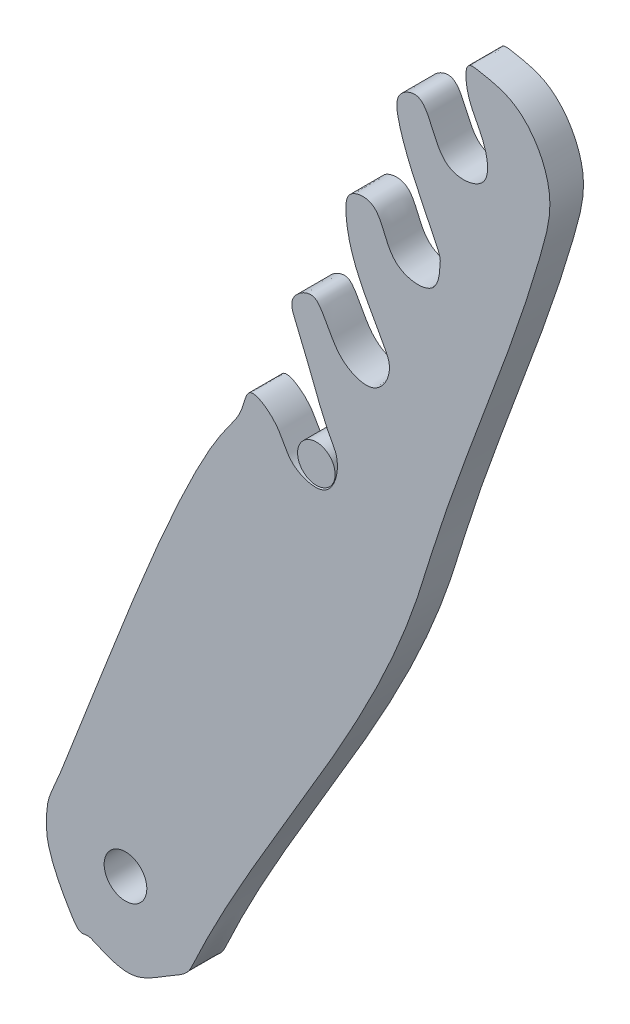
ISO-10303-21;
HEADER;
FILE_DESCRIPTION(('STEP AP214'),'2;1');
FILE_NAME('part.step','',(''),(''),'','','');
FILE_SCHEMA(('AUTOMOTIVE_DESIGN { 1 0 10303 214 1 1 1 1 }'));
ENDSEC;
DATA;
#1=APPLICATION_CONTEXT('core data for automotive mechanical design processes');
#2=APPLICATION_PROTOCOL_DEFINITION('international standard','automotive_design',2000,#1);
#3=PRODUCT_CONTEXT('',#1,'mechanical');
#4=PRODUCT('Part','Part','',(#3));
#5=PRODUCT_RELATED_PRODUCT_CATEGORY('part','',(#4));
#6=PRODUCT_DEFINITION_FORMATION('','',#4);
#7=PRODUCT_DEFINITION_CONTEXT('part definition',#1,'design');
#8=PRODUCT_DEFINITION('design','',#6,#7);
#9=PRODUCT_DEFINITION_SHAPE('','',#8);
#10=(LENGTH_UNIT() NAMED_UNIT(*) SI_UNIT(.MILLI.,.METRE.));
#11=(NAMED_UNIT(*) PLANE_ANGLE_UNIT() SI_UNIT($,.RADIAN.));
#12=(NAMED_UNIT(*) SI_UNIT($,.STERADIAN.) SOLID_ANGLE_UNIT());
#13=UNCERTAINTY_MEASURE_WITH_UNIT(LENGTH_MEASURE(1.E-05),#10,'distance_accuracy_value','');
#14=(GEOMETRIC_REPRESENTATION_CONTEXT(3) GLOBAL_UNCERTAINTY_ASSIGNED_CONTEXT((#13)) GLOBAL_UNIT_ASSIGNED_CONTEXT((#10,
#11,#12)) REPRESENTATION_CONTEXT('',''));
#15=CARTESIAN_POINT('',(0.,0.,0.));
#16=DIRECTION('',(0.,0.,1.));
#17=DIRECTION('',(1.,0.,0.));
#18=AXIS2_PLACEMENT_3D('',#15,#16,#17);
#19=CARTESIAN_POINT('',(113.201419893435,171.821068421186,6.3));
#20=DIRECTION('',(0.,0.,-1.));
#21=DIRECTION('',(-1.,0.,0.));
#22=AXIS2_PLACEMENT_3D('',#19,#20,#21);
#23=CYLINDRICAL_SURFACE('',#22,3.51816687890624);
#24=CARTESIAN_POINT('',(113.201419893435,171.821068421186,6.3));
#25=DIRECTION('',(0.,0.,1.));
#26=DIRECTION('',(1.,0.,0.));
#27=AXIS2_PLACEMENT_3D('',#24,#25,#26);
#28=CIRCLE('',#27,3.51816687890624);
#29=CARTESIAN_POINT('',(116.719586772342,171.821068421186,6.3));
#30=VERTEX_POINT('',#29);
#31=EDGE_CURVE('E11',#30,#30,#28,.T.);
#32=ORIENTED_EDGE('',*,*,#31,.F.);
#33=EDGE_LOOP('',(#32));
#34=FACE_BOUND('',#33,.T.);
#35=CARTESIAN_POINT('',(113.201419893435,171.821068421186,0.));
#36=DIRECTION('',(0.,0.,1.));
#37=DIRECTION('',(1.,0.,0.));
#38=AXIS2_PLACEMENT_3D('',#35,#36,#37);
#39=CIRCLE('',#38,3.51816687890624);
#40=CARTESIAN_POINT('',(116.719586772342,171.821068421186,0.));
#41=VERTEX_POINT('',#40);
#42=EDGE_CURVE('E44',#41,#41,#39,.T.);
#43=ORIENTED_EDGE('',*,*,#42,.T.);
#44=EDGE_LOOP('',(#43));
#45=FACE_BOUND('',#44,.T.);
#46=ADVANCED_FACE('F41',(#34,#45),#23,.T.);
#47=CARTESIAN_POINT('',(113.201419893435,171.821068421186,6.3));
#48=DIRECTION('',(0.,0.,1.));
#49=DIRECTION('',(1.,0.,0.));
#50=AXIS2_PLACEMENT_3D('',#47,#48,#49);
#51=PLANE('',#50);
#52=ORIENTED_EDGE('',*,*,#31,.T.);
#53=EDGE_LOOP('',(#52));
#54=FACE_BOUND('',#53,.T.);
#55=ADVANCED_FACE('F56',(#54),#51,.T.);
#56=CARTESIAN_POINT('',(113.201419893435,171.821068421186,0.));
#57=DIRECTION('',(0.,0.,1.));
#58=DIRECTION('',(1.,0.,0.));
#59=AXIS2_PLACEMENT_3D('',#56,#57,#58);
#60=PLANE('',#59);
#61=ORIENTED_EDGE('',*,*,#42,.F.);
#62=EDGE_LOOP('',(#61));
#63=FACE_BOUND('',#62,.T.);
#64=ADVANCED_FACE('F54',(#63),#60,.F.);
#65=CLOSED_SHELL('',(#46,#55,#64));
#66=MANIFOLD_SOLID_BREP('B2',#65);
#67=CARTESIAN_POINT('',(124.626865615542,189.857817812449,6.3));
#68=DIRECTION('',(0.,0.,1.));
#69=DIRECTION('',(1.,0.,0.));
#70=AXIS2_PLACEMENT_3D('',#67,#68,#69);
#71=PLANE('',#70);
#72=CARTESIAN_POINT('',(67.0252927659177,76.0863602532804,6.3));
#73=CARTESIAN_POINT('',(67.2292858128582,75.7494686688345,6.3));
#74=CARTESIAN_POINT('',(69.1499276290945,72.6337933220108,6.3));
#75=CARTESIAN_POINT('',(69.5016696807034,74.3849836722654,6.3));
#76=CARTESIAN_POINT('',(74.3713199157651,72.111744966761,6.3));
#77=CARTESIAN_POINT('',(79.2821998857994,70.5040074186216,6.3));
#78=CARTESIAN_POINT('',(84.8827267493798,74.6676370911425,6.3));
#79=CARTESIAN_POINT('',(89.0369949617047,76.7289046840619,6.3));
#80=CARTESIAN_POINT('',(102.563544690726,106.359280080205,6.3));
#81=CARTESIAN_POINT('',(124.618507741451,133.43417430427,6.3));
#82=CARTESIAN_POINT('',(139.978402557358,185.888736185902,6.3));
#83=CARTESIAN_POINT('',(151.31298260326,210.758883672524,6.3));
#84=CARTESIAN_POINT('',(158.315449918494,238.519105942226,6.3));
#85=CARTESIAN_POINT('',(152.397141673044,249.034503531704,6.3));
#86=CARTESIAN_POINT('',(145.562163363813,250.458936442758,6.3));
#87=CARTESIAN_POINT('',(141.239665640959,251.243065414904,6.3));
#88=CARTESIAN_POINT('',(141.033808091246,244.761389116365,6.3));
#89=CARTESIAN_POINT('',(144.886006628878,241.064200575097,6.3));
#90=CARTESIAN_POINT('',(146.006447512369,231.995345543194,6.3));
#91=CARTESIAN_POINT('',(134.792506719015,230.484064835085,6.3));
#92=CARTESIAN_POINT('',(134.631661144327,242.877027539453,6.3));
#93=CARTESIAN_POINT('',(127.838743830972,239.561223003098,6.3));
#94=CARTESIAN_POINT('',(129.133333787376,230.20883251947,6.3));
#95=CARTESIAN_POINT('',(136.529784175342,218.122849810988,6.3));
#96=CARTESIAN_POINT('',(136.367734620928,214.939235199143,6.3));
#97=CARTESIAN_POINT('',(135.998936685135,209.719832108027,6.3));
#98=CARTESIAN_POINT('',(125.5941766045,210.518746750791,6.3));
#99=CARTESIAN_POINT('',(125.845829837703,220.403590837998,6.3));
#100=CARTESIAN_POINT('',(118.655574843613,219.179728686355,6.3));
#101=CARTESIAN_POINT('',(118.654465213519,208.822145119779,6.3));
#102=CARTESIAN_POINT('',(123.378772805497,202.146630101151,6.3));
#103=CARTESIAN_POINT('',(127.67646678361,193.853796366058,6.3));
#104=CARTESIAN_POINT('',(124.658012710155,187.934307627844,6.3));
#105=CARTESIAN_POINT('',(116.82902764176,190.753603356198,6.3));
#106=CARTESIAN_POINT('',(115.452208441101,195.670697809487,6.3));
#107=CARTESIAN_POINT('',(112.29016488559,199.685686555161,6.3));
#108=CARTESIAN_POINT('',(107.6050336332,196.679039193535,6.3));
#109=CARTESIAN_POINT('',(111.43118466461,188.514325833746,6.3));
#110=CARTESIAN_POINT('',(114.268984852227,179.678529973346,6.3));
#111=CARTESIAN_POINT('',(117.814888455461,174.084790554608,6.3));
#112=CARTESIAN_POINT('',(116.16746878009,166.439707439639,6.3));
#113=CARTESIAN_POINT('',(107.76304333911,169.00156062545,6.3));
#114=CARTESIAN_POINT('',(106.700143177235,174.397801021354,6.3));
#115=CARTESIAN_POINT('',(100.057678776012,178.998741036567,6.3));
#116=CARTESIAN_POINT('',(99.5977076365518,172.972580541301,6.3));
#117=CARTESIAN_POINT('',(87.5353354382795,159.265539671397,6.3));
#118=CARTESIAN_POINT('',(67.252888780683,100.811046444422,6.3));
#119=CARTESIAN_POINT('',(62.2945698231085,91.2046714410294,6.3));
#120=CARTESIAN_POINT('',(62.7968195328825,83.069623009681,6.3));
#121=CARTESIAN_POINT('',(67.0252927659177,76.0863602532804,6.3));
#122=B_SPLINE_CURVE_WITH_KNOTS('',3,(#72,#73,#74,#75,#76,#77,#78,#79,#80,#81,#82,#83,#84,#85,
#86,#87,#88,#89,#90,#91,#92,#93,#94,#95,#96,#97,#98,#99,#100,#101,#102,#103,#104,#105,#106,#107,
#108,#109,#110,#111,#112,#113,#114,#115,#116,#117,#118,#119,#120,#121),.UNSPECIFIED.,.T.,.F.,(4,
1,1,1,1,1,1,1,1,1,1,1,1,1,1,1,1,1,1,1,1,1,1,1,1,1,1,1,1,1,1,1,1,1,1,1,1,1,1,1,1,1,1,1,1,1,1,4),
(0.,0.000559093537495614,0.00503184183746053,0.00642615157663895,0.0139430973917842,
0.0218108451390374,0.0261583354014462,0.0276847093933567,0.120753193839531,0.131769940881251,
0.195995154877373,0.205256848102949,0.219223065849055,0.226124694335565,0.227847744432704,
0.230840282849497,0.240775064172999,0.246684222710265,0.253398869165282,0.264523863944933,
0.267232456255153,0.272278964657824,0.290774547018884,0.294754529185927,0.312078786328247,
0.337299728088342,0.372826320540731,0.384987414229335,0.399958531604763,0.470825466261469,
0.480261298729675,0.502393876690904,0.523859422209412,0.553359427969942,0.559189625503124,
0.576781413980298,0.590203536664974,0.651816616226539,0.662252552424444,0.694562898644027,
0.723232785319956,0.751102692492783,0.776684495869815,0.798156669028913,0.819200532819754,
0.968465067005059,0.9884108204004,1.),.UNSPECIFIED.);
#123=CARTESIAN_POINT('',(67.0252927659177,76.0863602532804,6.3));
#124=VERTEX_POINT('',#123);
#125=EDGE_CURVE('E40',#124,#124,#122,.T.);
#126=ORIENTED_EDGE('',*,*,#125,.T.);
#127=EDGE_LOOP('',(#126));
#128=FACE_BOUND('',#127,.T.);
#129=CARTESIAN_POINT('',(77.4310427727168,86.9410175533268,6.3));
#130=DIRECTION('',(0.,0.,1.));
#131=DIRECTION('',(1.,0.,0.));
#132=AXIS2_PLACEMENT_3D('',#129,#130,#131);
#133=CIRCLE('',#132,4.00000000000001);
#134=CARTESIAN_POINT('',(81.4310427727169,86.9410175533268,6.3));
#135=VERTEX_POINT('',#134);
#136=EDGE_CURVE('E95',#135,#135,#133,.T.);
#137=ORIENTED_EDGE('',*,*,#136,.F.);
#138=EDGE_LOOP('',(#137));
#139=FACE_BOUND('',#138,.T.);
#140=ADVANCED_FACE('F82',(#128,#139),#71,.T.);
#141=CARTESIAN_POINT('',(124.626865615542,189.857817812449,0.));
#142=DIRECTION('',(0.,0.,1.));
#143=DIRECTION('',(1.,0.,0.));
#144=AXIS2_PLACEMENT_3D('',#141,#142,#143);
#145=PLANE('',#144);
#146=CARTESIAN_POINT('',(67.0252927659177,76.0863602532804,0.));
#147=CARTESIAN_POINT('',(67.2292858128582,75.7494686688345,0.));
#148=CARTESIAN_POINT('',(69.1499276290945,72.6337933220108,0.));
#149=CARTESIAN_POINT('',(69.5016696807034,74.3849836722654,0.));
#150=CARTESIAN_POINT('',(74.3713199157651,72.111744966761,0.));
#151=CARTESIAN_POINT('',(79.2821998857994,70.5040074186216,0.));
#152=CARTESIAN_POINT('',(84.8827267493798,74.6676370911425,0.));
#153=CARTESIAN_POINT('',(89.0369949617047,76.7289046840619,0.));
#154=CARTESIAN_POINT('',(102.563544690726,106.359280080205,0.));
#155=CARTESIAN_POINT('',(124.618507741451,133.43417430427,0.));
#156=CARTESIAN_POINT('',(139.978402557358,185.888736185902,0.));
#157=CARTESIAN_POINT('',(151.31298260326,210.758883672524,0.));
#158=CARTESIAN_POINT('',(158.315449918494,238.519105942226,0.));
#159=CARTESIAN_POINT('',(152.397141673044,249.034503531704,0.));
#160=CARTESIAN_POINT('',(145.562163363813,250.458936442758,0.));
#161=CARTESIAN_POINT('',(141.239665640959,251.243065414904,0.));
#162=CARTESIAN_POINT('',(141.033808091246,244.761389116365,0.));
#163=CARTESIAN_POINT('',(144.886006628878,241.064200575097,0.));
#164=CARTESIAN_POINT('',(146.006447512369,231.995345543194,0.));
#165=CARTESIAN_POINT('',(134.792506719015,230.484064835085,0.));
#166=CARTESIAN_POINT('',(134.631661144327,242.877027539453,0.));
#167=CARTESIAN_POINT('',(127.838743830972,239.561223003098,0.));
#168=CARTESIAN_POINT('',(129.133333787376,230.20883251947,0.));
#169=CARTESIAN_POINT('',(136.529784175342,218.122849810988,0.));
#170=CARTESIAN_POINT('',(136.367734620928,214.939235199143,0.));
#171=CARTESIAN_POINT('',(135.998936685135,209.719832108027,0.));
#172=CARTESIAN_POINT('',(125.5941766045,210.518746750791,0.));
#173=CARTESIAN_POINT('',(125.845829837703,220.403590837998,0.));
#174=CARTESIAN_POINT('',(118.655574843613,219.179728686355,0.));
#175=CARTESIAN_POINT('',(118.654465213519,208.822145119779,0.));
#176=CARTESIAN_POINT('',(123.378772805497,202.146630101151,0.));
#177=CARTESIAN_POINT('',(127.67646678361,193.853796366058,0.));
#178=CARTESIAN_POINT('',(124.658012710155,187.934307627844,0.));
#179=CARTESIAN_POINT('',(116.82902764176,190.753603356198,0.));
#180=CARTESIAN_POINT('',(115.452208441101,195.670697809487,0.));
#181=CARTESIAN_POINT('',(112.29016488559,199.685686555161,0.));
#182=CARTESIAN_POINT('',(107.6050336332,196.679039193535,0.));
#183=CARTESIAN_POINT('',(111.43118466461,188.514325833746,0.));
#184=CARTESIAN_POINT('',(114.268984852227,179.678529973346,0.));
#185=CARTESIAN_POINT('',(117.814888455461,174.084790554608,0.));
#186=CARTESIAN_POINT('',(116.16746878009,166.439707439639,0.));
#187=CARTESIAN_POINT('',(107.76304333911,169.00156062545,0.));
#188=CARTESIAN_POINT('',(106.700143177235,174.397801021354,0.));
#189=CARTESIAN_POINT('',(100.057678776012,178.998741036567,0.));
#190=CARTESIAN_POINT('',(99.5977076365518,172.972580541301,0.));
#191=CARTESIAN_POINT('',(87.5353354382795,159.265539671397,0.));
#192=CARTESIAN_POINT('',(67.252888780683,100.811046444422,0.));
#193=CARTESIAN_POINT('',(62.2945698231085,91.2046714410294,0.));
#194=CARTESIAN_POINT('',(62.7968195328825,83.069623009681,0.));
#195=CARTESIAN_POINT('',(67.0252927659177,76.0863602532804,0.));
#196=B_SPLINE_CURVE_WITH_KNOTS('',3,(#146,#147,#148,#149,#150,#151,#152,#153,#154,#155,#156,
#157,#158,#159,#160,#161,#162,#163,#164,#165,#166,#167,#168,#169,#170,#171,#172,#173,#174,#175,
#176,#177,#178,#179,#180,#181,#182,#183,#184,#185,#186,#187,#188,#189,#190,#191,#192,#193,#194,
#195),.UNSPECIFIED.,.T.,.F.,(4,1,1,1,1,1,1,1,1,1,1,1,1,1,1,1,1,1,1,1,1,1,1,1,1,1,1,1,1,1,1,1,1,
1,1,1,1,1,1,1,1,1,1,1,1,1,1,4),(0.,0.000559093537495614,0.00503184183746053,0.00642615157663895,
0.0139430973917842,0.0218108451390374,0.0261583354014462,0.0276847093933567,0.120753193839531,
0.131769940881251,0.195995154877373,0.205256848102949,0.219223065849055,0.226124694335565,
0.227847744432704,0.230840282849497,0.240775064172999,0.246684222710265,0.253398869165282,
0.264523863944933,0.267232456255153,0.272278964657824,0.290774547018884,0.294754529185927,
0.312078786328247,0.337299728088342,0.372826320540731,0.384987414229335,0.399958531604763,
0.470825466261469,0.480261298729675,0.502393876690904,0.523859422209412,0.553359427969942,
0.559189625503124,0.576781413980298,0.590203536664974,0.651816616226539,0.662252552424444,
0.694562898644027,0.723232785319956,0.751102692492783,0.776684495869815,0.798156669028913,
0.819200532819754,0.968465067005059,0.9884108204004,1.),.UNSPECIFIED.);
#197=CARTESIAN_POINT('',(67.0252927659177,76.0863602532804,0.));
#198=VERTEX_POINT('',#197);
#199=EDGE_CURVE('E87',#198,#198,#196,.T.);
#200=ORIENTED_EDGE('',*,*,#199,.F.);
#201=EDGE_LOOP('',(#200));
#202=FACE_BOUND('',#201,.T.);
#203=CARTESIAN_POINT('',(77.4310427727168,86.9410175533268,0.));
#204=DIRECTION('',(0.,0.,1.));
#205=DIRECTION('',(1.,0.,0.));
#206=AXIS2_PLACEMENT_3D('',#203,#204,#205);
#207=CIRCLE('',#206,4.00000000000001);
#208=CARTESIAN_POINT('',(81.4310427727169,86.9410175533268,0.));
#209=VERTEX_POINT('',#208);
#210=EDGE_CURVE('E100',#209,#209,#207,.T.);
#211=ORIENTED_EDGE('',*,*,#210,.T.);
#212=EDGE_LOOP('',(#211));
#213=FACE_BOUND('',#212,.T.);
#214=ADVANCED_FACE('F113',(#202,#213),#145,.F.);
#215=DIRECTION('',(0.,0.,-1.));
#216=VECTOR('',#215,1.);
#217=SURFACE_OF_LINEAR_EXTRUSION('',#122,#216);
#218=ORIENTED_EDGE('',*,*,#125,.F.);
#219=EDGE_LOOP('',(#218));
#220=FACE_BOUND('',#219,.T.);
#221=ORIENTED_EDGE('',*,*,#199,.T.);
#222=EDGE_LOOP('',(#221));
#223=FACE_BOUND('',#222,.T.);
#224=ADVANCED_FACE('F84',(#220,#223),#217,.F.);
#225=CARTESIAN_POINT('',(77.4310427727168,86.9410175533268,6.3));
#226=DIRECTION('',(0.,0.,-1.));
#227=DIRECTION('',(-1.,0.,0.));
#228=AXIS2_PLACEMENT_3D('',#225,#226,#227);
#229=CYLINDRICAL_SURFACE('',#228,4.00000000000001);
#230=ORIENTED_EDGE('',*,*,#136,.T.);
#231=EDGE_LOOP('',(#230));
#232=FACE_BOUND('',#231,.T.);
#233=ORIENTED_EDGE('',*,*,#210,.F.);
#234=EDGE_LOOP('',(#233));
#235=FACE_BOUND('',#234,.T.);
#236=ADVANCED_FACE('F109',(#232,#235),#229,.F.);
#237=CLOSED_SHELL('',(#140,#214,#224,#236));
#238=MANIFOLD_SOLID_BREP('B6',#237);
#239=ADVANCED_BREP_SHAPE_REPRESENTATION('',(#18,#66,#238),#14);
#240=SHAPE_DEFINITION_REPRESENTATION(#9,#239);
ENDSEC;
END-ISO-10303-21;
